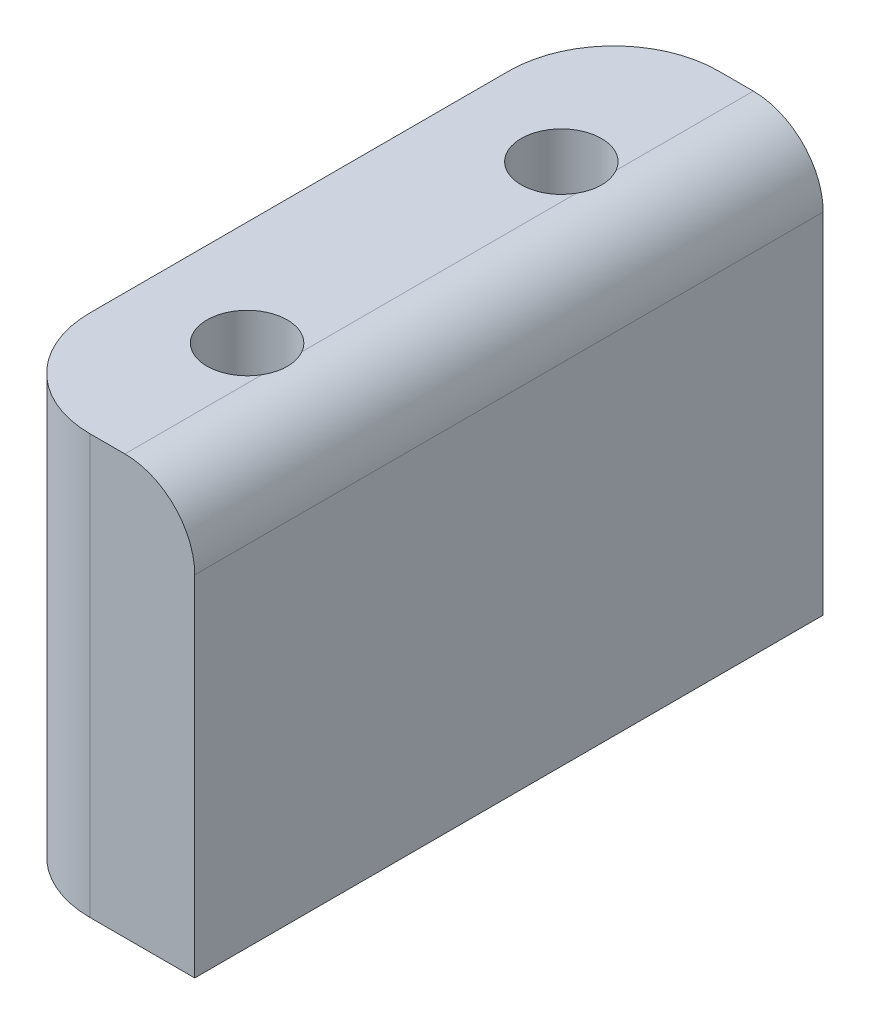
ISO-10303-21;
HEADER;
FILE_DESCRIPTION(('STEP AP214'),'2;1');
FILE_NAME('part.step','',(''),(''),'','','');
FILE_SCHEMA(('AUTOMOTIVE_DESIGN { 1 0 10303 214 1 1 1 1 }'));
ENDSEC;
DATA;
#1=APPLICATION_CONTEXT('core data for automotive mechanical design processes');
#2=APPLICATION_PROTOCOL_DEFINITION('international standard','automotive_design',2000,#1);
#3=PRODUCT_CONTEXT('',#1,'mechanical');
#4=PRODUCT('Part','Part','',(#3));
#5=PRODUCT_RELATED_PRODUCT_CATEGORY('part','',(#4));
#6=PRODUCT_DEFINITION_FORMATION('','',#4);
#7=PRODUCT_DEFINITION_CONTEXT('part definition',#1,'design');
#8=PRODUCT_DEFINITION('design','',#6,#7);
#9=PRODUCT_DEFINITION_SHAPE('','',#8);
#10=(LENGTH_UNIT() NAMED_UNIT(*) SI_UNIT(.MILLI.,.METRE.));
#11=(NAMED_UNIT(*) PLANE_ANGLE_UNIT() SI_UNIT($,.RADIAN.));
#12=(NAMED_UNIT(*) SI_UNIT($,.STERADIAN.) SOLID_ANGLE_UNIT());
#13=UNCERTAINTY_MEASURE_WITH_UNIT(LENGTH_MEASURE(1.E-05),#10,'distance_accuracy_value','');
#14=(GEOMETRIC_REPRESENTATION_CONTEXT(3) GLOBAL_UNCERTAINTY_ASSIGNED_CONTEXT((#13)) GLOBAL_UNIT_ASSIGNED_CONTEXT((#10,
#11,#12)) REPRESENTATION_CONTEXT('',''));
#15=CARTESIAN_POINT('',(0.,0.,0.));
#16=DIRECTION('',(0.,0.,1.));
#17=DIRECTION('',(1.,0.,0.));
#18=AXIS2_PLACEMENT_3D('',#15,#16,#17);
#19=CARTESIAN_POINT('',(6.,10.,18.));
#20=DIRECTION('',(-1.,0.,0.));
#21=DIRECTION('',(0.,-1.,0.));
#22=AXIS2_PLACEMENT_3D('',#19,#20,#21);
#23=PLANE('',#22);
#24=DIRECTION('',(0.,1.,0.));
#25=VECTOR('',#24,1.);
#26=CARTESIAN_POINT('',(6.,10.,0.));
#27=LINE('',#26,#25);
#28=CARTESIAN_POINT('',(6.,0.,0.));
#29=VERTEX_POINT('',#28);
#30=CARTESIAN_POINT('',(6.,10.,0.));
#31=VERTEX_POINT('',#30);
#32=EDGE_CURVE('E186',#29,#31,#27,.T.);
#33=ORIENTED_EDGE('',*,*,#32,.T.);
#34=DIRECTION('',(0.,0.,-1.));
#35=VECTOR('',#34,1.);
#36=CARTESIAN_POINT('',(6.,10.,18.));
#37=LINE('',#36,#35);
#38=CARTESIAN_POINT('',(6.,10.,18.));
#39=VERTEX_POINT('',#38);
#40=EDGE_CURVE('E131',#39,#31,#37,.T.);
#41=ORIENTED_EDGE('',*,*,#40,.F.);
#42=DIRECTION('',(0.,1.,0.));
#43=VECTOR('',#42,1.);
#44=CARTESIAN_POINT('',(6.,10.,18.));
#45=LINE('',#44,#43);
#46=CARTESIAN_POINT('',(6.,0.,18.));
#47=VERTEX_POINT('',#46);
#48=EDGE_CURVE('E181',#47,#39,#45,.T.);
#49=ORIENTED_EDGE('',*,*,#48,.F.);
#50=DIRECTION('',(0.,0.,-1.));
#51=VECTOR('',#50,1.);
#52=CARTESIAN_POINT('',(6.,0.,18.));
#53=LINE('',#52,#51);
#54=EDGE_CURVE('E175',#47,#29,#53,.T.);
#55=ORIENTED_EDGE('',*,*,#54,.T.);
#56=EDGE_LOOP('',(#33,#41,#49,#55));
#57=FACE_BOUND('',#56,.T.);
#58=ADVANCED_FACE('F38',(#57),#23,.F.);
#59=CARTESIAN_POINT('',(4.,10.,18.));
#60=DIRECTION('',(0.,0.,-1.));
#61=DIRECTION('',(-1.,0.,0.));
#62=AXIS2_PLACEMENT_3D('',#59,#60,#61);
#63=CYLINDRICAL_SURFACE('',#62,2.);
#64=DIRECTION('',(0.,0.,-1.));
#65=VECTOR('',#64,1.);
#66=CARTESIAN_POINT('',(4.,12.,18.));
#67=LINE('',#66,#65);
#68=CARTESIAN_POINT('',(4.,12.,12.93210916542));
#69=VERTEX_POINT('',#68);
#70=CARTESIAN_POINT('',(4.,12.,5.06789083458003));
#71=VERTEX_POINT('',#70);
#72=EDGE_CURVE('E121',#69,#71,#67,.T.);
#73=ORIENTED_EDGE('',*,*,#72,.F.);
#74=CARTESIAN_POINT('',(4.,12.,12.93210916542));
#75=CARTESIAN_POINT('',(4.015976676805,11.9999975730184,12.9602427548098));
#76=CARTESIAN_POINT('',(4.03075737103304,11.9998089826464,12.9890363212357));
#77=CARTESIAN_POINT('',(4.05784067394007,11.9992096954842,13.0477616197972));
#78=CARTESIAN_POINT('',(4.07014346215658,11.9987990147937,13.0776932692858));
#79=CARTESIAN_POINT('',(4.1031514012445,11.9974614130766,13.1687699709964));
#80=CARTESIAN_POINT('',(4.12004050860909,11.9964273483085,13.2313457539786));
#81=CARTESIAN_POINT('',(4.14308856747591,11.9949086550491,13.358475267523));
#82=CARTESIAN_POINT('',(4.14923866579803,11.9944244799986,13.4230305854377));
#83=CARTESIAN_POINT('',(4.15062863844358,11.9943196330838,13.5522634769723));
#84=CARTESIAN_POINT('',(4.14586697310429,11.994699083078,13.6169410665582));
#85=CARTESIAN_POINT('',(4.12490452249198,11.9961258282252,13.7485887258121));
#86=CARTESIAN_POINT('',(4.10801070080707,11.9972131921843,13.8154511895222));
#87=CARTESIAN_POINT('',(4.07395365122148,11.9986632394017,13.9126905056374));
#88=CARTESIAN_POINT('',(4.06112033225897,11.9991170169893,13.9446444456901));
#89=CARTESIAN_POINT('',(4.03264288513083,11.9997838898041,14.007277604392));
#90=CARTESIAN_POINT('',(4.01699869185039,11.9999969794548,14.0379567934909));
#91=CARTESIAN_POINT('',(4.,12.,14.06789083458));
#92=B_SPLINE_CURVE_WITH_KNOTS('',3,(#74,#75,#76,#77,#78,#79,#80,#81,#82,#83,#84,#85,#86,#87,#88,
#89,#90,#91),.UNSPECIFIED.,.F.,.F.,(4,2,2,2,2,2,2,2,4),(0.,0.0969989780953908,0.193990925566652,
0.387467698863245,0.581103898178917,0.774767421473168,0.980475838801985,1.08366918087429,
1.18686491376142),.UNSPECIFIED.);
#93=CARTESIAN_POINT('',(4.,12.,14.06789083458));
#94=VERTEX_POINT('',#93);
#95=EDGE_CURVE('E189',#69,#94,#92,.T.);
#96=ORIENTED_EDGE('',*,*,#95,.T.);
#97=CARTESIAN_POINT('',(4.,12.,18.));
#98=VERTEX_POINT('',#97);
#99=EDGE_CURVE('E129',#98,#94,#67,.T.);
#100=ORIENTED_EDGE('',*,*,#99,.F.);
#101=CARTESIAN_POINT('',(4.,10.,18.));
#102=DIRECTION('',(0.,0.,1.));
#103=DIRECTION('',(1.,0.,0.));
#104=AXIS2_PLACEMENT_3D('',#101,#102,#103);
#105=CIRCLE('',#104,2.);
#106=EDGE_CURVE('E161',#39,#98,#105,.T.);
#107=ORIENTED_EDGE('',*,*,#106,.F.);
#108=ORIENTED_EDGE('',*,*,#40,.T.);
#109=CARTESIAN_POINT('',(4.,10.,0.));
#110=DIRECTION('',(0.,0.,1.));
#111=DIRECTION('',(1.,0.,0.));
#112=AXIS2_PLACEMENT_3D('',#109,#110,#111);
#113=CIRCLE('',#112,2.);
#114=CARTESIAN_POINT('',(4.,12.,0.));
#115=VERTEX_POINT('',#114);
#116=EDGE_CURVE('E184',#31,#115,#113,.T.);
#117=ORIENTED_EDGE('',*,*,#116,.T.);
#118=CARTESIAN_POINT('',(4.,12.,3.93210916541997));
#119=VERTEX_POINT('',#118);
#120=EDGE_CURVE('E123',#119,#115,#67,.T.);
#121=ORIENTED_EDGE('',*,*,#120,.F.);
#122=CARTESIAN_POINT('',(4.,12.,3.93210916541997));
#123=CARTESIAN_POINT('',(4.015976676805,11.9999975730184,3.9602427548098));
#124=CARTESIAN_POINT('',(4.03075737103304,11.9998089826464,3.98903632123566));
#125=CARTESIAN_POINT('',(4.05784067394007,11.9992096954842,4.04776161979721));
#126=CARTESIAN_POINT('',(4.07014346215658,11.9987990147937,4.07769326928576));
#127=CARTESIAN_POINT('',(4.1031514012445,11.9974614130766,4.16876997099641));
#128=CARTESIAN_POINT('',(4.12004050860909,11.9964273483085,4.23134575397862));
#129=CARTESIAN_POINT('',(4.14308856747591,11.9949086550491,4.35847526752297));
#130=CARTESIAN_POINT('',(4.14923866579803,11.9944244799986,4.42303058543768));
#131=CARTESIAN_POINT('',(4.15062863844359,11.9943196330838,4.55226347697228));
#132=CARTESIAN_POINT('',(4.1458669731043,11.994699083078,4.61694106655823));
#133=CARTESIAN_POINT('',(4.12490452249199,11.9961258282252,4.74858872581213));
#134=CARTESIAN_POINT('',(4.10801070080707,11.9972131921843,4.81545118952224));
#135=CARTESIAN_POINT('',(4.07395365122148,11.9986632394017,4.91269050563738));
#136=CARTESIAN_POINT('',(4.06112033225898,11.9991170169893,4.94464444569013));
#137=CARTESIAN_POINT('',(4.03264288513083,11.9997838898041,5.00727760439202));
#138=CARTESIAN_POINT('',(4.01699869185039,11.9999969794548,5.03795679349086));
#139=CARTESIAN_POINT('',(4.,12.,5.06789083458003));
#140=B_SPLINE_CURVE_WITH_KNOTS('',3,(#122,#123,#124,#125,#126,#127,#128,#129,#130,#131,#132,
#133,#134,#135,#136,#137,#138,#139),.UNSPECIFIED.,.F.,.F.,(4,2,2,2,2,2,2,2,4),(0.,
0.0969989780953908,0.193990925566652,0.387467698863247,0.581103898178914,0.774767421473167,
0.980475838801986,1.08366918087429,1.18686491376142),.UNSPECIFIED.);
#141=EDGE_CURVE('E112',#119,#71,#140,.T.);
#142=ORIENTED_EDGE('',*,*,#141,.T.);
#143=EDGE_LOOP('',(#73,#96,#100,#107,#108,#117,#121,#142));
#144=FACE_BOUND('',#143,.T.);
#145=ADVANCED_FACE('F119',(#144),#63,.T.);
#146=CARTESIAN_POINT('',(0.,12.,18.));
#147=DIRECTION('',(0.,-1.,0.));
#148=DIRECTION('',(0.,0.,-1.));
#149=AXIS2_PLACEMENT_3D('',#146,#147,#148);
#150=PLANE('',#149);
#151=DIRECTION('',(0.,0.,-1.));
#152=VECTOR('',#151,1.);
#153=CARTESIAN_POINT('',(0.,12.,18.));
#154=LINE('',#153,#152);
#155=CARTESIAN_POINT('',(0.,12.,15.));
#156=VERTEX_POINT('',#155);
#157=CARTESIAN_POINT('',(0.,12.,3.));
#158=VERTEX_POINT('',#157);
#159=EDGE_CURVE('E132',#156,#158,#154,.T.);
#160=ORIENTED_EDGE('',*,*,#159,.F.);
#161=CARTESIAN_POINT('',(3.,12.,15.));
#162=DIRECTION('',(0.,-1.,0.));
#163=DIRECTION('',(0.,0.,-1.));
#164=AXIS2_PLACEMENT_3D('',#161,#162,#163);
#165=CIRCLE('',#164,3.);
#166=CARTESIAN_POINT('',(3.,12.,18.));
#167=VERTEX_POINT('',#166);
#168=EDGE_CURVE('E46',#156,#167,#165,.F.);
#169=ORIENTED_EDGE('',*,*,#168,.T.);
#170=DIRECTION('',(-1.,0.,0.));
#171=VECTOR('',#170,1.);
#172=CARTESIAN_POINT('',(0.,12.,18.));
#173=LINE('',#172,#171);
#174=EDGE_CURVE('E153',#98,#167,#173,.T.);
#175=ORIENTED_EDGE('',*,*,#174,.F.);
#176=ORIENTED_EDGE('',*,*,#99,.T.);
#177=CARTESIAN_POINT('',(3.,12.,13.5));
#178=DIRECTION('',(0.,-1.,0.));
#179=DIRECTION('',(0.,0.,-1.));
#180=AXIS2_PLACEMENT_3D('',#177,#178,#179);
#181=CIRCLE('',#180,1.15);
#182=EDGE_CURVE('E124',#94,#69,#181,.T.);
#183=ORIENTED_EDGE('',*,*,#182,.T.);
#184=ORIENTED_EDGE('',*,*,#72,.T.);
#185=CARTESIAN_POINT('',(3.,12.,4.5));
#186=DIRECTION('',(0.,-1.,0.));
#187=DIRECTION('',(0.,0.,-1.));
#188=AXIS2_PLACEMENT_3D('',#185,#186,#187);
#189=CIRCLE('',#188,1.15);
#190=EDGE_CURVE('E109',#71,#119,#189,.T.);
#191=ORIENTED_EDGE('',*,*,#190,.T.);
#192=ORIENTED_EDGE('',*,*,#120,.T.);
#193=DIRECTION('',(-1.,0.,0.));
#194=VECTOR('',#193,1.);
#195=CARTESIAN_POINT('',(0.,12.,0.));
#196=LINE('',#195,#194);
#197=CARTESIAN_POINT('',(3.,12.,0.));
#198=VERTEX_POINT('',#197);
#199=EDGE_CURVE('E182',#115,#198,#196,.T.);
#200=ORIENTED_EDGE('',*,*,#199,.T.);
#201=CARTESIAN_POINT('',(3.,12.,3.));
#202=DIRECTION('',(0.,-1.,0.));
#203=DIRECTION('',(0.,0.,-1.));
#204=AXIS2_PLACEMENT_3D('',#201,#202,#203);
#205=CIRCLE('',#204,3.);
#206=EDGE_CURVE('E58',#198,#158,#205,.F.);
#207=ORIENTED_EDGE('',*,*,#206,.T.);
#208=EDGE_LOOP('',(#160,#169,#175,#176,#183,#184,#191,#192,#200,#207));
#209=FACE_BOUND('',#208,.T.);
#210=ADVANCED_FACE('F127',(#209),#150,.F.);
#211=CARTESIAN_POINT('',(0.,0.,18.));
#212=DIRECTION('',(1.,0.,0.));
#213=DIRECTION('',(0.,0.,-1.));
#214=AXIS2_PLACEMENT_3D('',#211,#212,#213);
#215=PLANE('',#214);
#216=DIRECTION('',(0.,0.,-1.));
#217=VECTOR('',#216,1.);
#218=CARTESIAN_POINT('',(0.,0.,18.));
#219=LINE('',#218,#217);
#220=CARTESIAN_POINT('',(0.,0.,15.));
#221=VERTEX_POINT('',#220);
#222=CARTESIAN_POINT('',(0.,0.,3.));
#223=VERTEX_POINT('',#222);
#224=EDGE_CURVE('E170',#221,#223,#219,.T.);
#225=ORIENTED_EDGE('',*,*,#224,.F.);
#226=DIRECTION('',(0.,-1.,0.));
#227=VECTOR('',#226,1.);
#228=CARTESIAN_POINT('',(0.,12.,15.));
#229=LINE('',#228,#227);
#230=EDGE_CURVE('E148',#221,#156,#229,.F.);
#231=ORIENTED_EDGE('',*,*,#230,.T.);
#232=ORIENTED_EDGE('',*,*,#159,.T.);
#233=DIRECTION('',(0.,-1.,0.));
#234=VECTOR('',#233,1.);
#235=CARTESIAN_POINT('',(0.,0.,3.));
#236=LINE('',#235,#234);
#237=EDGE_CURVE('E145',#158,#223,#236,.T.);
#238=ORIENTED_EDGE('',*,*,#237,.T.);
#239=EDGE_LOOP('',(#225,#231,#232,#238));
#240=FACE_BOUND('',#239,.T.);
#241=ADVANCED_FACE('F173',(#240),#215,.F.);
#242=CARTESIAN_POINT('',(6.,0.,18.));
#243=DIRECTION('',(0.,1.,0.));
#244=DIRECTION('',(-1.,0.,0.));
#245=AXIS2_PLACEMENT_3D('',#242,#243,#244);
#246=PLANE('',#245);
#247=CARTESIAN_POINT('',(3.,0.,13.5));
#248=DIRECTION('',(0.,-1.,0.));
#249=DIRECTION('',(1.,0.,0.));
#250=AXIS2_PLACEMENT_3D('',#247,#248,#249);
#251=CIRCLE('',#250,1.15);
#252=CARTESIAN_POINT('',(4.15,0.,13.5));
#253=VERTEX_POINT('',#252);
#254=EDGE_CURVE('E115',#253,#253,#251,.T.);
#255=ORIENTED_EDGE('',*,*,#254,.F.);
#256=EDGE_LOOP('',(#255));
#257=FACE_BOUND('',#256,.T.);
#258=CARTESIAN_POINT('',(3.,0.,4.5));
#259=DIRECTION('',(0.,-1.,0.));
#260=DIRECTION('',(1.,0.,0.));
#261=AXIS2_PLACEMENT_3D('',#258,#259,#260);
#262=CIRCLE('',#261,1.15);
#263=CARTESIAN_POINT('',(4.15,0.,4.5));
#264=VERTEX_POINT('',#263);
#265=EDGE_CURVE('E217',#264,#264,#262,.T.);
#266=ORIENTED_EDGE('',*,*,#265,.F.);
#267=EDGE_LOOP('',(#266));
#268=FACE_BOUND('',#267,.T.);
#269=DIRECTION('',(1.,0.,0.));
#270=VECTOR('',#269,1.);
#271=CARTESIAN_POINT('',(6.,0.,18.));
#272=LINE('',#271,#270);
#273=CARTESIAN_POINT('',(3.,0.,18.));
#274=VERTEX_POINT('',#273);
#275=EDGE_CURVE('E163',#274,#47,#272,.T.);
#276=ORIENTED_EDGE('',*,*,#275,.F.);
#277=CARTESIAN_POINT('',(3.,0.,15.));
#278=DIRECTION('',(0.,1.,0.));
#279=DIRECTION('',(-1.,0.,0.));
#280=AXIS2_PLACEMENT_3D('',#277,#278,#279);
#281=CIRCLE('',#280,3.);
#282=EDGE_CURVE('E143',#274,#221,#281,.F.);
#283=ORIENTED_EDGE('',*,*,#282,.T.);
#284=ORIENTED_EDGE('',*,*,#224,.T.);
#285=CARTESIAN_POINT('',(3.,0.,3.));
#286=DIRECTION('',(0.,1.,0.));
#287=DIRECTION('',(-1.,0.,0.));
#288=AXIS2_PLACEMENT_3D('',#285,#286,#287);
#289=CIRCLE('',#288,3.);
#290=CARTESIAN_POINT('',(3.,0.,0.));
#291=VERTEX_POINT('',#290);
#292=EDGE_CURVE('E141',#223,#291,#289,.F.);
#293=ORIENTED_EDGE('',*,*,#292,.T.);
#294=DIRECTION('',(1.,0.,0.));
#295=VECTOR('',#294,1.);
#296=CARTESIAN_POINT('',(6.,0.,0.));
#297=LINE('',#296,#295);
#298=EDGE_CURVE('E179',#291,#29,#297,.T.);
#299=ORIENTED_EDGE('',*,*,#298,.T.);
#300=ORIENTED_EDGE('',*,*,#54,.F.);
#301=EDGE_LOOP('',(#276,#283,#284,#293,#299,#300));
#302=FACE_BOUND('',#301,.T.);
#303=ADVANCED_FACE('F169',(#257,#268,#302),#246,.F.);
#304=CARTESIAN_POINT('',(4.,10.,18.));
#305=DIRECTION('',(0.,0.,1.));
#306=DIRECTION('',(1.,0.,0.));
#307=AXIS2_PLACEMENT_3D('',#304,#305,#306);
#308=PLANE('',#307);
#309=ORIENTED_EDGE('',*,*,#174,.T.);
#310=DIRECTION('',(0.,-1.,0.));
#311=VECTOR('',#310,1.);
#312=CARTESIAN_POINT('',(3.,0.,18.));
#313=LINE('',#312,#311);
#314=EDGE_CURVE('E138',#167,#274,#313,.T.);
#315=ORIENTED_EDGE('',*,*,#314,.T.);
#316=ORIENTED_EDGE('',*,*,#275,.T.);
#317=ORIENTED_EDGE('',*,*,#48,.T.);
#318=ORIENTED_EDGE('',*,*,#106,.T.);
#319=EDGE_LOOP('',(#309,#315,#316,#317,#318));
#320=FACE_BOUND('',#319,.T.);
#321=ADVANCED_FACE('F158',(#320),#308,.T.);
#322=CARTESIAN_POINT('',(4.,10.,0.));
#323=DIRECTION('',(0.,0.,1.));
#324=DIRECTION('',(1.,0.,0.));
#325=AXIS2_PLACEMENT_3D('',#322,#323,#324);
#326=PLANE('',#325);
#327=ORIENTED_EDGE('',*,*,#298,.F.);
#328=DIRECTION('',(0.,-1.,0.));
#329=VECTOR('',#328,1.);
#330=CARTESIAN_POINT('',(3.,10.,0.));
#331=LINE('',#330,#329);
#332=EDGE_CURVE('E11',#291,#198,#331,.F.);
#333=ORIENTED_EDGE('',*,*,#332,.T.);
#334=ORIENTED_EDGE('',*,*,#199,.F.);
#335=ORIENTED_EDGE('',*,*,#116,.F.);
#336=ORIENTED_EDGE('',*,*,#32,.F.);
#337=EDGE_LOOP('',(#327,#333,#334,#335,#336));
#338=FACE_BOUND('',#337,.T.);
#339=ADVANCED_FACE('F210',(#338),#326,.F.);
#340=CARTESIAN_POINT('',(3.,16.,4.5));
#341=DIRECTION('',(0.,-1.,0.));
#342=DIRECTION('',(1.,0.,0.));
#343=AXIS2_PLACEMENT_3D('',#340,#341,#342);
#344=CYLINDRICAL_SURFACE('',#343,1.15);
#345=ORIENTED_EDGE('',*,*,#265,.T.);
#346=EDGE_LOOP('',(#345));
#347=FACE_BOUND('',#346,.T.);
#348=ORIENTED_EDGE('',*,*,#190,.F.);
#349=ORIENTED_EDGE('',*,*,#141,.F.);
#350=EDGE_LOOP('',(#348,#349));
#351=FACE_BOUND('',#350,.T.);
#352=ADVANCED_FACE('F111',(#347,#351),#344,.F.);
#353=CARTESIAN_POINT('',(3.,16.,13.5));
#354=DIRECTION('',(0.,-1.,0.));
#355=DIRECTION('',(1.,0.,0.));
#356=AXIS2_PLACEMENT_3D('',#353,#354,#355);
#357=CYLINDRICAL_SURFACE('',#356,1.15);
#358=ORIENTED_EDGE('',*,*,#254,.T.);
#359=EDGE_LOOP('',(#358));
#360=FACE_BOUND('',#359,.T.);
#361=ORIENTED_EDGE('',*,*,#182,.F.);
#362=ORIENTED_EDGE('',*,*,#95,.F.);
#363=EDGE_LOOP('',(#361,#362));
#364=FACE_BOUND('',#363,.T.);
#365=ADVANCED_FACE('F202',(#360,#364),#357,.F.);
#366=CARTESIAN_POINT('',(3.,10.,15.));
#367=DIRECTION('',(0.,1.,0.));
#368=DIRECTION('',(0.,0.,1.));
#369=AXIS2_PLACEMENT_3D('',#366,#367,#368);
#370=CYLINDRICAL_SURFACE('',#369,3.);
#371=ORIENTED_EDGE('',*,*,#168,.F.);
#372=ORIENTED_EDGE('',*,*,#230,.F.);
#373=ORIENTED_EDGE('',*,*,#282,.F.);
#374=ORIENTED_EDGE('',*,*,#314,.F.);
#375=EDGE_LOOP('',(#371,#372,#373,#374));
#376=FACE_BOUND('',#375,.T.);
#377=ADVANCED_FACE('F165',(#376),#370,.T.);
#378=CARTESIAN_POINT('',(3.,0.,3.));
#379=DIRECTION('',(0.,-1.,0.));
#380=DIRECTION('',(0.,0.,-1.));
#381=AXIS2_PLACEMENT_3D('',#378,#379,#380);
#382=CYLINDRICAL_SURFACE('',#381,3.);
#383=ORIENTED_EDGE('',*,*,#206,.F.);
#384=ORIENTED_EDGE('',*,*,#332,.F.);
#385=ORIENTED_EDGE('',*,*,#292,.F.);
#386=ORIENTED_EDGE('',*,*,#237,.F.);
#387=EDGE_LOOP('',(#383,#384,#385,#386));
#388=FACE_BOUND('',#387,.T.);
#389=ADVANCED_FACE('F40',(#388),#382,.T.);
#390=CLOSED_SHELL('',(#58,#145,#210,#241,#303,#321,#339,#352,#365,#377,#389));
#391=MANIFOLD_SOLID_BREP('B2',#390);
#392=ADVANCED_BREP_SHAPE_REPRESENTATION('',(#18,#391),#14);
#393=SHAPE_DEFINITION_REPRESENTATION(#9,#392);
ENDSEC;
END-ISO-10303-21;
